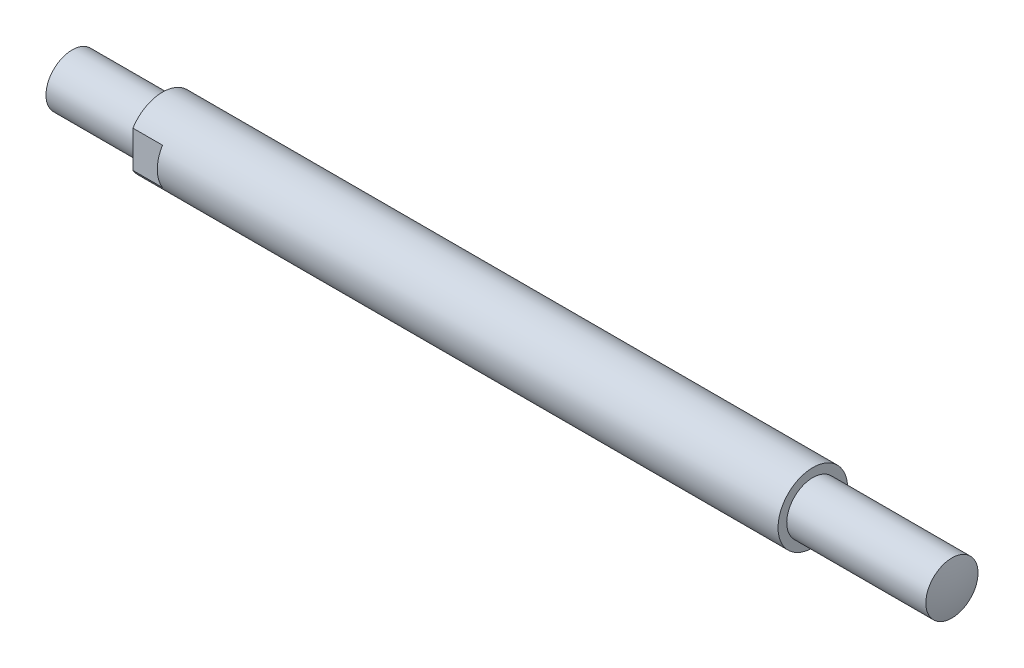
ISO-10303-21;
HEADER;
FILE_DESCRIPTION(('STEP AP214'),'2;1');
FILE_NAME('part.step','',(''),(''),'','','');
FILE_SCHEMA(('AUTOMOTIVE_DESIGN { 1 0 10303 214 1 1 1 1 }'));
ENDSEC;
DATA;
#1=APPLICATION_CONTEXT('core data for automotive mechanical design processes');
#2=APPLICATION_PROTOCOL_DEFINITION('international standard','automotive_design',2000,#1);
#3=PRODUCT_CONTEXT('',#1,'mechanical');
#4=PRODUCT('Part','Part','',(#3));
#5=PRODUCT_RELATED_PRODUCT_CATEGORY('part','',(#4));
#6=PRODUCT_DEFINITION_FORMATION('','',#4);
#7=PRODUCT_DEFINITION_CONTEXT('part definition',#1,'design');
#8=PRODUCT_DEFINITION('design','',#6,#7);
#9=PRODUCT_DEFINITION_SHAPE('','',#8);
#10=(LENGTH_UNIT() NAMED_UNIT(*) SI_UNIT(.MILLI.,.METRE.));
#11=(NAMED_UNIT(*) PLANE_ANGLE_UNIT() SI_UNIT($,.RADIAN.));
#12=(NAMED_UNIT(*) SI_UNIT($,.STERADIAN.) SOLID_ANGLE_UNIT());
#13=UNCERTAINTY_MEASURE_WITH_UNIT(LENGTH_MEASURE(1.E-05),#10,'distance_accuracy_value','');
#14=(GEOMETRIC_REPRESENTATION_CONTEXT(3) GLOBAL_UNCERTAINTY_ASSIGNED_CONTEXT((#13)) GLOBAL_UNIT_ASSIGNED_CONTEXT((#10,
#11,#12)) REPRESENTATION_CONTEXT('',''));
#15=CARTESIAN_POINT('',(0.,0.,0.));
#16=DIRECTION('',(0.,0.,1.));
#17=DIRECTION('',(1.,0.,0.));
#18=AXIS2_PLACEMENT_3D('',#15,#16,#17);
#19=CARTESIAN_POINT('',(-241.,0.,0.));
#20=DIRECTION('',(-1.,0.,0.));
#21=DIRECTION('',(0.,-1.,0.));
#22=AXIS2_PLACEMENT_3D('',#19,#20,#21);
#23=CYLINDRICAL_SURFACE('',#22,15.);
#24=CARTESIAN_POINT('',(187.,0.,0.));
#25=DIRECTION('',(-1.,0.,0.));
#26=DIRECTION('',(0.,-1.,0.));
#27=AXIS2_PLACEMENT_3D('',#24,#25,#26);
#28=CIRCLE('',#27,15.);
#29=CARTESIAN_POINT('',(187.,-15.,0.));
#30=VERTEX_POINT('',#29);
#31=EDGE_CURVE('E114',#30,#30,#28,.T.);
#32=ORIENTED_EDGE('',*,*,#31,.F.);
#33=EDGE_LOOP('',(#32));
#34=FACE_BOUND('',#33,.T.);
#35=CARTESIAN_POINT('',(267.,0.,0.));
#36=DIRECTION('',(-1.,0.,0.));
#37=DIRECTION('',(0.,-1.,0.));
#38=AXIS2_PLACEMENT_3D('',#35,#36,#37);
#39=CIRCLE('',#38,15.);
#40=CARTESIAN_POINT('',(267.,-15.,0.));
#41=VERTEX_POINT('',#40);
#42=EDGE_CURVE('E123',#41,#41,#39,.T.);
#43=ORIENTED_EDGE('',*,*,#42,.T.);
#44=EDGE_LOOP('',(#43));
#45=FACE_BOUND('',#44,.T.);
#46=ADVANCED_FACE('F47',(#34,#45),#23,.T.);
#47=CARTESIAN_POINT('',(211.75,0.,0.));
#48=DIRECTION('',(-1.,0.,0.));
#49=DIRECTION('',(0.,1.,0.));
#50=AXIS2_PLACEMENT_3D('',#47,#48,#49);
#51=SPHERICAL_SURFACE('',#50,57.2500000000001);
#52=ORIENTED_EDGE('',*,*,#42,.F.);
#53=EDGE_LOOP('',(#52));
#54=FACE_BOUND('',#53,.T.);
#55=ADVANCED_FACE('F142',(#54),#51,.T.);
#56=CARTESIAN_POINT('',(-183.75,0.,0.));
#57=DIRECTION('',(-1.,0.,0.));
#58=DIRECTION('',(0.,1.,0.));
#59=AXIS2_PLACEMENT_3D('',#56,#57,#58);
#60=SPHERICAL_SURFACE('',#59,57.2499999999999);
#61=CARTESIAN_POINT('',(-239.,0.,0.));
#62=DIRECTION('',(-1.,0.,0.));
#63=DIRECTION('',(0.,-1.,0.));
#64=AXIS2_PLACEMENT_3D('',#61,#62,#63);
#65=CIRCLE('',#64,15.);
#66=CARTESIAN_POINT('',(-239.,-15.,0.));
#67=VERTEX_POINT('',#66);
#68=EDGE_CURVE('E120',#67,#67,#65,.T.);
#69=ORIENTED_EDGE('',*,*,#68,.T.);
#70=EDGE_LOOP('',(#69));
#71=FACE_BOUND('',#70,.T.);
#72=ADVANCED_FACE('F146',(#71),#60,.T.);
#73=CARTESIAN_POINT('',(-241.,0.,0.));
#74=DIRECTION('',(-1.,0.,0.));
#75=DIRECTION('',(0.,-1.,0.));
#76=AXIS2_PLACEMENT_3D('',#73,#74,#75);
#77=CYLINDRICAL_SURFACE('',#76,15.);
#78=ORIENTED_EDGE('',*,*,#68,.F.);
#79=EDGE_LOOP('',(#78));
#80=FACE_BOUND('',#79,.T.);
#81=CARTESIAN_POINT('',(-187.,0.,0.));
#82=DIRECTION('',(-1.,0.,0.));
#83=DIRECTION('',(0.,-1.,0.));
#84=AXIS2_PLACEMENT_3D('',#81,#82,#83);
#85=CIRCLE('',#84,15.);
#86=CARTESIAN_POINT('',(-187.,-15.,0.));
#87=VERTEX_POINT('',#86);
#88=EDGE_CURVE('E112',#87,#87,#85,.T.);
#89=ORIENTED_EDGE('',*,*,#88,.T.);
#90=EDGE_LOOP('',(#89));
#91=FACE_BOUND('',#90,.T.);
#92=ADVANCED_FACE('F152',(#80,#91),#77,.T.);
#93=CARTESIAN_POINT('',(-187.,15.,0.));
#94=DIRECTION('',(1.,0.,0.));
#95=DIRECTION('',(0.,1.,0.));
#96=AXIS2_PLACEMENT_3D('',#93,#94,#95);
#97=PLANE('',#96);
#98=ORIENTED_EDGE('',*,*,#88,.F.);
#99=EDGE_LOOP('',(#98));
#100=FACE_BOUND('',#99,.T.);
#101=CARTESIAN_POINT('',(-187.,0.,0.));
#102=DIRECTION('',(-1.,0.,0.));
#103=DIRECTION('',(0.,-1.,0.));
#104=AXIS2_PLACEMENT_3D('',#101,#102,#103);
#105=CIRCLE('',#104,20.);
#106=CARTESIAN_POINT('',(-187.,-10.5356537528528,-17.));
#107=VERTEX_POINT('',#106);
#108=CARTESIAN_POINT('',(-187.,-10.5356537528528,17.));
#109=VERTEX_POINT('',#108);
#110=EDGE_CURVE('E102',#107,#109,#105,.T.);
#111=ORIENTED_EDGE('',*,*,#110,.T.);
#112=DIRECTION('',(0.,-1.,0.));
#113=VECTOR('',#112,1.);
#114=CARTESIAN_POINT('',(-187.,17.8844279530009,17.));
#115=LINE('',#114,#113);
#116=CARTESIAN_POINT('',(-187.,10.5356537528528,17.));
#117=VERTEX_POINT('',#116);
#118=EDGE_CURVE('E105',#117,#109,#115,.T.);
#119=ORIENTED_EDGE('',*,*,#118,.F.);
#120=CARTESIAN_POINT('',(-187.,10.5356537528528,-17.));
#121=VERTEX_POINT('',#120);
#122=EDGE_CURVE('E104',#117,#121,#105,.T.);
#123=ORIENTED_EDGE('',*,*,#122,.T.);
#124=DIRECTION('',(0.,1.,0.));
#125=VECTOR('',#124,1.);
#126=CARTESIAN_POINT('',(-187.,17.3284353741512,-17.));
#127=LINE('',#126,#125);
#128=EDGE_CURVE('E89',#107,#121,#127,.T.);
#129=ORIENTED_EDGE('',*,*,#128,.F.);
#130=EDGE_LOOP('',(#111,#119,#123,#129));
#131=FACE_BOUND('',#130,.T.);
#132=ADVANCED_FACE('F100',(#100,#131),#97,.F.);
#133=CARTESIAN_POINT('',(-241.,0.,0.));
#134=DIRECTION('',(-1.,0.,0.));
#135=DIRECTION('',(0.,-1.,0.));
#136=AXIS2_PLACEMENT_3D('',#133,#134,#135);
#137=CYLINDRICAL_SURFACE('',#136,20.);
#138=CARTESIAN_POINT('',(-170.,0.,0.));
#139=DIRECTION('',(-1.,0.,0.));
#140=DIRECTION('',(0.,0.,1.));
#141=AXIS2_PLACEMENT_3D('',#138,#139,#140);
#142=CIRCLE('',#141,20.);
#143=CARTESIAN_POINT('',(-170.,-10.5356537528528,17.));
#144=VERTEX_POINT('',#143);
#145=CARTESIAN_POINT('',(-170.,10.5356537528528,17.));
#146=VERTEX_POINT('',#145);
#147=EDGE_CURVE('E128',#144,#146,#142,.T.);
#148=ORIENTED_EDGE('',*,*,#147,.F.);
#149=DIRECTION('',(-1.,0.,0.));
#150=VECTOR('',#149,1.);
#151=CARTESIAN_POINT('',(-241.,-10.5356537528528,17.));
#152=LINE('',#151,#150);
#153=EDGE_CURVE('E11',#144,#109,#152,.T.);
#154=ORIENTED_EDGE('',*,*,#153,.T.);
#155=ORIENTED_EDGE('',*,*,#110,.F.);
#156=DIRECTION('',(-1.,0.,0.));
#157=VECTOR('',#156,1.);
#158=CARTESIAN_POINT('',(-241.,-10.5356537528528,-17.));
#159=LINE('',#158,#157);
#160=CARTESIAN_POINT('',(-170.,-10.5356537528528,-17.));
#161=VERTEX_POINT('',#160);
#162=EDGE_CURVE('E86',#107,#161,#159,.F.);
#163=ORIENTED_EDGE('',*,*,#162,.T.);
#164=CARTESIAN_POINT('',(-170.,0.,0.));
#165=DIRECTION('',(-1.,0.,0.));
#166=DIRECTION('',(0.,0.,1.));
#167=AXIS2_PLACEMENT_3D('',#164,#165,#166);
#168=CIRCLE('',#167,20.);
#169=CARTESIAN_POINT('',(-170.,10.5356537528528,-17.));
#170=VERTEX_POINT('',#169);
#171=EDGE_CURVE('E95',#170,#161,#168,.T.);
#172=ORIENTED_EDGE('',*,*,#171,.F.);
#173=DIRECTION('',(-1.,0.,0.));
#174=VECTOR('',#173,1.);
#175=CARTESIAN_POINT('',(-241.,10.5356537528528,-17.));
#176=LINE('',#175,#174);
#177=EDGE_CURVE('E94',#170,#121,#176,.T.);
#178=ORIENTED_EDGE('',*,*,#177,.T.);
#179=ORIENTED_EDGE('',*,*,#122,.F.);
#180=DIRECTION('',(-1.,0.,0.));
#181=VECTOR('',#180,1.);
#182=CARTESIAN_POINT('',(-241.,10.5356537528528,17.));
#183=LINE('',#182,#181);
#184=EDGE_CURVE('E54',#117,#146,#183,.F.);
#185=ORIENTED_EDGE('',*,*,#184,.T.);
#186=EDGE_LOOP('',(#148,#154,#155,#163,#172,#178,#179,#185));
#187=FACE_BOUND('',#186,.T.);
#188=CARTESIAN_POINT('',(187.,0.,0.));
#189=DIRECTION('',(-1.,0.,0.));
#190=DIRECTION('',(0.,-1.,0.));
#191=AXIS2_PLACEMENT_3D('',#188,#189,#190);
#192=CIRCLE('',#191,20.);
#193=CARTESIAN_POINT('',(187.,-20.,0.));
#194=VERTEX_POINT('',#193);
#195=EDGE_CURVE('E110',#194,#194,#192,.T.);
#196=ORIENTED_EDGE('',*,*,#195,.T.);
#197=EDGE_LOOP('',(#196));
#198=FACE_BOUND('',#197,.T.);
#199=ADVANCED_FACE('F108',(#187,#198),#137,.T.);
#200=CARTESIAN_POINT('',(187.,20.,0.));
#201=DIRECTION('',(-1.,0.,0.));
#202=DIRECTION('',(0.,-1.,0.));
#203=AXIS2_PLACEMENT_3D('',#200,#201,#202);
#204=PLANE('',#203);
#205=ORIENTED_EDGE('',*,*,#195,.F.);
#206=EDGE_LOOP('',(#205));
#207=FACE_BOUND('',#206,.T.);
#208=ORIENTED_EDGE('',*,*,#31,.T.);
#209=EDGE_LOOP('',(#208));
#210=FACE_BOUND('',#209,.T.);
#211=ADVANCED_FACE('F138',(#207,#210),#204,.F.);
#212=CARTESIAN_POINT('',(-170.,17.3284353741512,-17.));
#213=DIRECTION('',(0.,0.,1.));
#214=DIRECTION('',(0.,-1.,0.));
#215=AXIS2_PLACEMENT_3D('',#212,#213,#214);
#216=PLANE('',#215);
#217=DIRECTION('',(0.,1.,0.));
#218=VECTOR('',#217,1.);
#219=CARTESIAN_POINT('',(-170.,17.3284353741512,-17.));
#220=LINE('',#219,#218);
#221=EDGE_CURVE('E67',#161,#170,#220,.T.);
#222=ORIENTED_EDGE('',*,*,#221,.F.);
#223=ORIENTED_EDGE('',*,*,#162,.F.);
#224=ORIENTED_EDGE('',*,*,#128,.T.);
#225=ORIENTED_EDGE('',*,*,#177,.F.);
#226=EDGE_LOOP('',(#222,#223,#224,#225));
#227=FACE_BOUND('',#226,.T.);
#228=ADVANCED_FACE('F88',(#227),#216,.F.);
#229=CARTESIAN_POINT('',(-170.,0.,0.));
#230=DIRECTION('',(-1.,0.,0.));
#231=DIRECTION('',(0.,0.,1.));
#232=AXIS2_PLACEMENT_3D('',#229,#230,#231);
#233=PLANE('',#232);
#234=ORIENTED_EDGE('',*,*,#171,.T.);
#235=ORIENTED_EDGE('',*,*,#221,.T.);
#236=EDGE_LOOP('',(#234,#235));
#237=FACE_BOUND('',#236,.T.);
#238=ADVANCED_FACE('F167',(#237),#233,.T.);
#239=CARTESIAN_POINT('',(-170.,17.8844279530009,17.));
#240=DIRECTION('',(0.,0.,-1.));
#241=DIRECTION('',(0.,1.,0.));
#242=AXIS2_PLACEMENT_3D('',#239,#240,#241);
#243=PLANE('',#242);
#244=DIRECTION('',(0.,-1.,0.));
#245=VECTOR('',#244,1.);
#246=CARTESIAN_POINT('',(-170.,17.8844279530009,17.));
#247=LINE('',#246,#245);
#248=EDGE_CURVE('E60',#146,#144,#247,.T.);
#249=ORIENTED_EDGE('',*,*,#248,.F.);
#250=ORIENTED_EDGE('',*,*,#184,.F.);
#251=ORIENTED_EDGE('',*,*,#118,.T.);
#252=ORIENTED_EDGE('',*,*,#153,.F.);
#253=EDGE_LOOP('',(#249,#250,#251,#252));
#254=FACE_BOUND('',#253,.T.);
#255=ADVANCED_FACE('F131',(#254),#243,.F.);
#256=CARTESIAN_POINT('',(-170.,0.,0.));
#257=DIRECTION('',(-1.,0.,0.));
#258=DIRECTION('',(0.,0.,1.));
#259=AXIS2_PLACEMENT_3D('',#256,#257,#258);
#260=PLANE('',#259);
#261=ORIENTED_EDGE('',*,*,#147,.T.);
#262=ORIENTED_EDGE('',*,*,#248,.T.);
#263=EDGE_LOOP('',(#261,#262));
#264=FACE_BOUND('',#263,.T.);
#265=ADVANCED_FACE('F174',(#264),#260,.T.);
#266=CLOSED_SHELL('',(#46,#55,#72,#92,#132,#199,#211,#228,#238,#255,#265));
#267=MANIFOLD_SOLID_BREP('B2',#266);
#268=ADVANCED_BREP_SHAPE_REPRESENTATION('',(#18,#267),#14);
#269=SHAPE_DEFINITION_REPRESENTATION(#9,#268);
ENDSEC;
END-ISO-10303-21;
